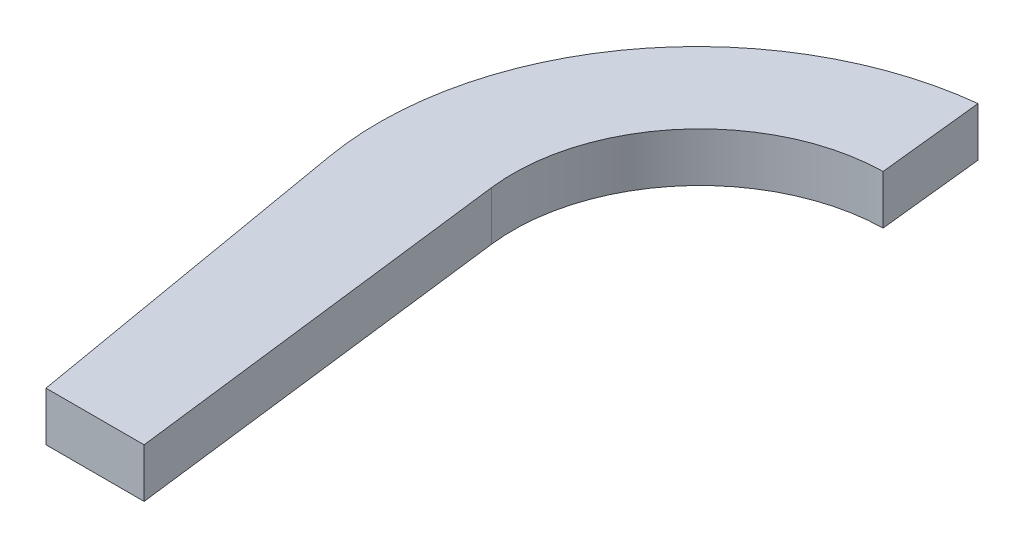
ISO-10303-21;
HEADER;
FILE_DESCRIPTION(('STEP AP214'),'2;1');
FILE_NAME('part.step','',(''),(''),'','','');
FILE_SCHEMA(('AUTOMOTIVE_DESIGN { 1 0 10303 214 1 1 1 1 }'));
ENDSEC;
DATA;
#1=APPLICATION_CONTEXT('core data for automotive mechanical design processes');
#2=APPLICATION_PROTOCOL_DEFINITION('international standard','automotive_design',2000,#1);
#3=PRODUCT_CONTEXT('',#1,'mechanical');
#4=PRODUCT('Part','Part','',(#3));
#5=PRODUCT_RELATED_PRODUCT_CATEGORY('part','',(#4));
#6=PRODUCT_DEFINITION_FORMATION('','',#4);
#7=PRODUCT_DEFINITION_CONTEXT('part definition',#1,'design');
#8=PRODUCT_DEFINITION('design','',#6,#7);
#9=PRODUCT_DEFINITION_SHAPE('','',#8);
#10=(LENGTH_UNIT() NAMED_UNIT(*) SI_UNIT(.MILLI.,.METRE.));
#11=(NAMED_UNIT(*) PLANE_ANGLE_UNIT() SI_UNIT($,.RADIAN.));
#12=(NAMED_UNIT(*) SI_UNIT($,.STERADIAN.) SOLID_ANGLE_UNIT());
#13=UNCERTAINTY_MEASURE_WITH_UNIT(LENGTH_MEASURE(1.E-05),#10,'distance_accuracy_value','');
#14=(GEOMETRIC_REPRESENTATION_CONTEXT(3) GLOBAL_UNCERTAINTY_ASSIGNED_CONTEXT((#13)) GLOBAL_UNIT_ASSIGNED_CONTEXT((#10,
#11,#12)) REPRESENTATION_CONTEXT('',''));
#15=CARTESIAN_POINT('',(0.,0.,0.));
#16=DIRECTION('',(0.,0.,1.));
#17=DIRECTION('',(1.,0.,0.));
#18=AXIS2_PLACEMENT_3D('',#15,#16,#17);
#19=CARTESIAN_POINT('',(-19.0500000000003,19.05,0.));
#20=DIRECTION('',(0.985497949050428,0.,-0.169687337233515));
#21=DIRECTION('',(-0.169687337233515,0.,-0.985497949050428));
#22=AXIS2_PLACEMENT_3D('',#19,#20,#21);
#23=PLANE('',#22);
#24=DIRECTION('',(0.169687337233515,0.,0.985497949050428));
#25=VECTOR('',#24,1.);
#26=CARTESIAN_POINT('',(-19.0500000000003,0.,0.));
#27=LINE('',#26,#25);
#28=CARTESIAN_POINT('',(-41.9501588753552,0.,-132.997900565405));
#29=VERTEX_POINT('',#28);
#30=CARTESIAN_POINT('',(-19.0500000000003,0.,0.));
#31=VERTEX_POINT('',#30);
#32=EDGE_CURVE('E117',#29,#31,#27,.T.);
#33=ORIENTED_EDGE('',*,*,#32,.T.);
#34=DIRECTION('',(0.,-1.,0.));
#35=VECTOR('',#34,1.);
#36=CARTESIAN_POINT('',(-19.0500000000003,19.05,0.));
#37=LINE('',#36,#35);
#38=CARTESIAN_POINT('',(-19.0500000000003,19.05,0.));
#39=VERTEX_POINT('',#38);
#40=EDGE_CURVE('E11',#39,#31,#37,.T.);
#41=ORIENTED_EDGE('',*,*,#40,.F.);
#42=DIRECTION('',(0.169687337233515,0.,0.985497949050428));
#43=VECTOR('',#42,1.);
#44=CARTESIAN_POINT('',(-19.0500000000003,19.05,0.));
#45=LINE('',#44,#43);
#46=CARTESIAN_POINT('',(-41.9501588753552,19.05,-132.997900565405));
#47=VERTEX_POINT('',#46);
#48=EDGE_CURVE('E127',#47,#39,#45,.T.);
#49=ORIENTED_EDGE('',*,*,#48,.F.);
#50=DIRECTION('',(0.,-1.,0.));
#51=VECTOR('',#50,1.);
#52=CARTESIAN_POINT('',(-41.9501588753552,19.05,-132.997900565405));
#53=LINE('',#52,#51);
#54=EDGE_CURVE('E113',#47,#29,#53,.T.);
#55=ORIENTED_EDGE('',*,*,#54,.T.);
#56=EDGE_LOOP('',(#33,#41,#49,#55));
#57=FACE_BOUND('',#56,.T.);
#58=ADVANCED_FACE('F33',(#57),#23,.F.);
#59=CARTESIAN_POINT('',(-19.0500000000003,19.05,0.));
#60=DIRECTION('',(0.,0.,-1.));
#61=DIRECTION('',(-1.,0.,0.));
#62=AXIS2_PLACEMENT_3D('',#59,#60,#61);
#63=PLANE('',#62);
#64=DIRECTION('',(1.,0.,0.));
#65=VECTOR('',#64,1.);
#66=CARTESIAN_POINT('',(-19.0500000000003,0.,0.));
#67=LINE('',#66,#65);
#68=CARTESIAN_POINT('',(19.0500000000002,0.,0.));
#69=VERTEX_POINT('',#68);
#70=EDGE_CURVE('E120',#31,#69,#67,.T.);
#71=ORIENTED_EDGE('',*,*,#70,.T.);
#72=DIRECTION('',(0.,-1.,0.));
#73=VECTOR('',#72,1.);
#74=CARTESIAN_POINT('',(19.0500000000002,19.05,0.));
#75=LINE('',#74,#73);
#76=CARTESIAN_POINT('',(19.0500000000002,19.05,0.));
#77=VERTEX_POINT('',#76);
#78=EDGE_CURVE('E41',#77,#69,#75,.T.);
#79=ORIENTED_EDGE('',*,*,#78,.F.);
#80=DIRECTION('',(1.,0.,0.));
#81=VECTOR('',#80,1.);
#82=CARTESIAN_POINT('',(-19.0500000000003,19.05,0.));
#83=LINE('',#82,#81);
#84=EDGE_CURVE('E86',#39,#77,#83,.T.);
#85=ORIENTED_EDGE('',*,*,#84,.F.);
#86=ORIENTED_EDGE('',*,*,#40,.T.);
#87=EDGE_LOOP('',(#71,#79,#85,#86));
#88=FACE_BOUND('',#87,.T.);
#89=ADVANCED_FACE('F151',(#88),#63,.F.);
#90=CARTESIAN_POINT('',(19.0500000000002,19.05,0.));
#91=DIRECTION('',(-0.992430521958537,0.,0.12280740647496));
#92=DIRECTION('',(0.12280740647496,0.,0.992430521958537));
#93=AXIS2_PLACEMENT_3D('',#90,#91,#92);
#94=PLANE('',#93);
#95=DIRECTION('',(-0.12280740647496,0.,-0.992430521958537));
#96=VECTOR('',#95,1.);
#97=CARTESIAN_POINT('',(19.0500000000002,0.,0.));
#98=LINE('',#97,#96);
#99=CARTESIAN_POINT('',(0.,0.,-153.946752773133));
#100=VERTEX_POINT('',#99);
#101=EDGE_CURVE('E122',#69,#100,#98,.T.);
#102=ORIENTED_EDGE('',*,*,#101,.T.);
#103=DIRECTION('',(0.,-1.,0.));
#104=VECTOR('',#103,1.);
#105=CARTESIAN_POINT('',(0.,19.05,-153.946752773133));
#106=LINE('',#105,#104);
#107=CARTESIAN_POINT('',(0.,19.05,-153.946752773133));
#108=VERTEX_POINT('',#107);
#109=EDGE_CURVE('E108',#108,#100,#106,.T.);
#110=ORIENTED_EDGE('',*,*,#109,.F.);
#111=DIRECTION('',(-0.12280740647496,0.,-0.992430521958537));
#112=VECTOR('',#111,1.);
#113=CARTESIAN_POINT('',(19.0500000000002,19.05,0.));
#114=LINE('',#113,#112);
#115=EDGE_CURVE('E99',#77,#108,#114,.T.);
#116=ORIENTED_EDGE('',*,*,#115,.F.);
#117=ORIENTED_EDGE('',*,*,#78,.T.);
#118=EDGE_LOOP('',(#102,#110,#116,#117));
#119=FACE_BOUND('',#118,.T.);
#120=ADVANCED_FACE('F133',(#119),#94,.F.);
#121=CARTESIAN_POINT('',(72.0111944473055,19.05,-162.85771211141));
#122=DIRECTION('',(0.,-1.,0.));
#123=DIRECTION('',(0.,0.,-1.));
#124=AXIS2_PLACEMENT_3D('',#121,#122,#123);
#125=CYLINDRICAL_SURFACE('',#124,72.5604390977347);
#126=CARTESIAN_POINT('',(72.0111944473055,0.,-162.85771211141));
#127=DIRECTION('',(0.,-1.,0.));
#128=DIRECTION('',(0.,0.,-1.));
#129=AXIS2_PLACEMENT_3D('',#126,#127,#128);
#130=CIRCLE('',#129,72.5604390977347);
#131=CARTESIAN_POINT('',(70.5967209486203,0.,-235.404363217974));
#132=VERTEX_POINT('',#131);
#133=EDGE_CURVE('E107',#100,#132,#130,.T.);
#134=ORIENTED_EDGE('',*,*,#133,.T.);
#135=DIRECTION('',(0.,-1.,0.));
#136=VECTOR('',#135,1.);
#137=CARTESIAN_POINT('',(70.5967209486203,19.05,-235.404363217974));
#138=LINE('',#137,#136);
#139=CARTESIAN_POINT('',(70.5967209486203,19.05,-235.404363217974));
#140=VERTEX_POINT('',#139);
#141=EDGE_CURVE('E104',#140,#132,#138,.T.);
#142=ORIENTED_EDGE('',*,*,#141,.F.);
#143=CARTESIAN_POINT('',(72.0111944473055,19.05,-162.85771211141));
#144=DIRECTION('',(0.,-1.,0.));
#145=DIRECTION('',(0.,0.,-1.));
#146=AXIS2_PLACEMENT_3D('',#143,#144,#145);
#147=CIRCLE('',#146,72.5604390977347);
#148=EDGE_CURVE('E93',#108,#140,#147,.T.);
#149=ORIENTED_EDGE('',*,*,#148,.F.);
#150=ORIENTED_EDGE('',*,*,#109,.T.);
#151=EDGE_LOOP('',(#134,#142,#149,#150));
#152=FACE_BOUND('',#151,.T.);
#153=ADVANCED_FACE('F105',(#152),#125,.F.);
#154=CARTESIAN_POINT('',(70.5967209486203,19.05,-235.404363217974));
#155=DIRECTION('',(-0.994345895152173,0.,0.106189645418107));
#156=DIRECTION('',(0.106189645418107,0.,0.994345895152173));
#157=AXIS2_PLACEMENT_3D('',#154,#155,#156);
#158=PLANE('',#157);
#159=DIRECTION('',(-0.106189645418107,0.,-0.994345895152173));
#160=VECTOR('',#159,1.);
#161=CARTESIAN_POINT('',(70.5967209486203,0.,-235.404363217974));
#162=LINE('',#161,#160);
#163=CARTESIAN_POINT('',(66.190957042321,0.,-276.659357883314));
#164=VERTEX_POINT('',#163);
#165=EDGE_CURVE('E72',#132,#164,#162,.T.);
#166=ORIENTED_EDGE('',*,*,#165,.T.);
#167=DIRECTION('',(0.,-1.,0.));
#168=VECTOR('',#167,1.);
#169=CARTESIAN_POINT('',(66.190957042321,19.05,-276.659357883314));
#170=LINE('',#169,#168);
#171=CARTESIAN_POINT('',(66.190957042321,19.05,-276.659357883314));
#172=VERTEX_POINT('',#171);
#173=EDGE_CURVE('E109',#172,#164,#170,.T.);
#174=ORIENTED_EDGE('',*,*,#173,.F.);
#175=DIRECTION('',(-0.106189645418107,0.,-0.994345895152173));
#176=VECTOR('',#175,1.);
#177=CARTESIAN_POINT('',(70.5967209486203,19.05,-235.404363217974));
#178=LINE('',#177,#176);
#179=EDGE_CURVE('E97',#140,#172,#178,.T.);
#180=ORIENTED_EDGE('',*,*,#179,.F.);
#181=ORIENTED_EDGE('',*,*,#141,.T.);
#182=EDGE_LOOP('',(#166,#174,#180,#181));
#183=FACE_BOUND('',#182,.T.);
#184=ADVANCED_FACE('F111',(#183),#158,.F.);
#185=CARTESIAN_POINT('',(79.7150827523445,19.05,-153.946752773133));
#186=DIRECTION('',(0.,-1.,0.));
#187=DIRECTION('',(0.,0.,-1.));
#188=AXIS2_PLACEMENT_3D('',#185,#186,#187);
#189=CYLINDRICAL_SURFACE('',#188,123.455601044051);
#190=CARTESIAN_POINT('',(79.7150827523445,0.,-153.946752773133));
#191=DIRECTION('',(0.,1.,0.));
#192=DIRECTION('',(0.,0.,-1.));
#193=AXIS2_PLACEMENT_3D('',#190,#191,#192);
#194=CIRCLE('',#193,123.455601044051);
#195=EDGE_CURVE('E78',#164,#29,#194,.T.);
#196=ORIENTED_EDGE('',*,*,#195,.T.);
#197=ORIENTED_EDGE('',*,*,#54,.F.);
#198=CARTESIAN_POINT('',(79.7150827523445,19.05,-153.946752773133));
#199=DIRECTION('',(0.,1.,0.));
#200=DIRECTION('',(0.,0.,-1.));
#201=AXIS2_PLACEMENT_3D('',#198,#199,#200);
#202=CIRCLE('',#201,123.455601044051);
#203=EDGE_CURVE('E49',#172,#47,#202,.T.);
#204=ORIENTED_EDGE('',*,*,#203,.F.);
#205=ORIENTED_EDGE('',*,*,#173,.T.);
#206=EDGE_LOOP('',(#196,#197,#204,#205));
#207=FACE_BOUND('',#206,.T.);
#208=ADVANCED_FACE('F140',(#207),#189,.T.);
#209=CARTESIAN_POINT('',(79.7150827523445,19.05,-153.946752773133));
#210=DIRECTION('',(0.,-1.,0.));
#211=DIRECTION('',(0.,0.,-1.));
#212=AXIS2_PLACEMENT_3D('',#209,#210,#211);
#213=PLANE('',#212);
#214=ORIENTED_EDGE('',*,*,#48,.T.);
#215=ORIENTED_EDGE('',*,*,#84,.T.);
#216=ORIENTED_EDGE('',*,*,#115,.T.);
#217=ORIENTED_EDGE('',*,*,#148,.T.);
#218=ORIENTED_EDGE('',*,*,#179,.T.);
#219=ORIENTED_EDGE('',*,*,#203,.T.);
#220=EDGE_LOOP('',(#214,#215,#216,#217,#218,#219));
#221=FACE_BOUND('',#220,.T.);
#222=ADVANCED_FACE('F95',(#221),#213,.F.);
#223=CARTESIAN_POINT('',(79.7150827523445,0.,-153.946752773133));
#224=DIRECTION('',(0.,-1.,0.));
#225=DIRECTION('',(0.,0.,-1.));
#226=AXIS2_PLACEMENT_3D('',#223,#224,#225);
#227=PLANE('',#226);
#228=ORIENTED_EDGE('',*,*,#32,.F.);
#229=ORIENTED_EDGE('',*,*,#195,.F.);
#230=ORIENTED_EDGE('',*,*,#165,.F.);
#231=ORIENTED_EDGE('',*,*,#133,.F.);
#232=ORIENTED_EDGE('',*,*,#101,.F.);
#233=ORIENTED_EDGE('',*,*,#70,.F.);
#234=EDGE_LOOP('',(#228,#229,#230,#231,#232,#233));
#235=FACE_BOUND('',#234,.T.);
#236=ADVANCED_FACE('F136',(#235),#227,.T.);
#237=CLOSED_SHELL('',(#58,#89,#120,#153,#184,#208,#222,#236));
#238=MANIFOLD_SOLID_BREP('B2',#237);
#239=ADVANCED_BREP_SHAPE_REPRESENTATION('',(#18,#238),#14);
#240=SHAPE_DEFINITION_REPRESENTATION(#9,#239);
ENDSEC;
END-ISO-10303-21;
